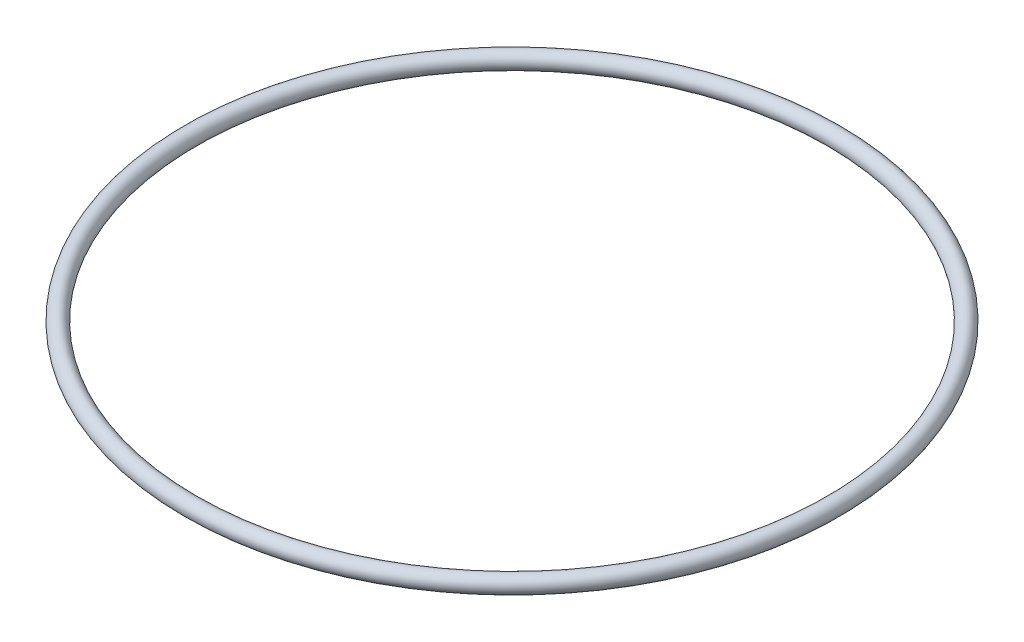
ISO-10303-21;
HEADER;
FILE_DESCRIPTION(('STEP AP214'),'2;1');
FILE_NAME('part.step','',(''),(''),'','','');
FILE_SCHEMA(('AUTOMOTIVE_DESIGN { 1 0 10303 214 1 1 1 1 }'));
ENDSEC;
DATA;
#1=APPLICATION_CONTEXT('core data for automotive mechanical design processes');
#2=APPLICATION_PROTOCOL_DEFINITION('international standard','automotive_design',2000,#1);
#3=PRODUCT_CONTEXT('',#1,'mechanical');
#4=PRODUCT('Part','Part','',(#3));
#5=PRODUCT_RELATED_PRODUCT_CATEGORY('part','',(#4));
#6=PRODUCT_DEFINITION_FORMATION('','',#4);
#7=PRODUCT_DEFINITION_CONTEXT('part definition',#1,'design');
#8=PRODUCT_DEFINITION('design','',#6,#7);
#9=PRODUCT_DEFINITION_SHAPE('','',#8);
#10=(LENGTH_UNIT() NAMED_UNIT(*) SI_UNIT(.MILLI.,.METRE.));
#11=(NAMED_UNIT(*) PLANE_ANGLE_UNIT() SI_UNIT($,.RADIAN.));
#12=(NAMED_UNIT(*) SI_UNIT($,.STERADIAN.) SOLID_ANGLE_UNIT());
#13=UNCERTAINTY_MEASURE_WITH_UNIT(LENGTH_MEASURE(1.E-05),#10,'distance_accuracy_value','');
#14=(GEOMETRIC_REPRESENTATION_CONTEXT(3) GLOBAL_UNCERTAINTY_ASSIGNED_CONTEXT((#13)) GLOBAL_UNIT_ASSIGNED_CONTEXT((#10,
#11,#12)) REPRESENTATION_CONTEXT('',''));
#15=CARTESIAN_POINT('',(0.,0.,0.));
#16=DIRECTION('',(0.,0.,1.));
#17=DIRECTION('',(1.,0.,0.));
#18=AXIS2_PLACEMENT_3D('',#15,#16,#17);
#19=CARTESIAN_POINT('',(0.,0.,0.));
#20=DIRECTION('',(0.,-1.,0.));
#21=DIRECTION('',(0.,0.,-1.));
#22=AXIS2_PLACEMENT_3D('',#19,#20,#21);
#23=TOROIDAL_SURFACE('',#22,34.145,0.89);
#24=CARTESIAN_POINT('',(0.,0.,-35.035));
#25=VERTEX_POINT('',#24);
#26=VERTEX_LOOP('',#25);
#27=FACE_BOUND('',#26,.T.);
#28=ADVANCED_FACE('F33',(#27),#23,.T.);
#29=CLOSED_SHELL('',(#28));
#30=MANIFOLD_SOLID_BREP('B2',#29);
#31=ADVANCED_BREP_SHAPE_REPRESENTATION('',(#18,#30),#14);
#32=SHAPE_DEFINITION_REPRESENTATION(#9,#31);
ENDSEC;
END-ISO-10303-21;
